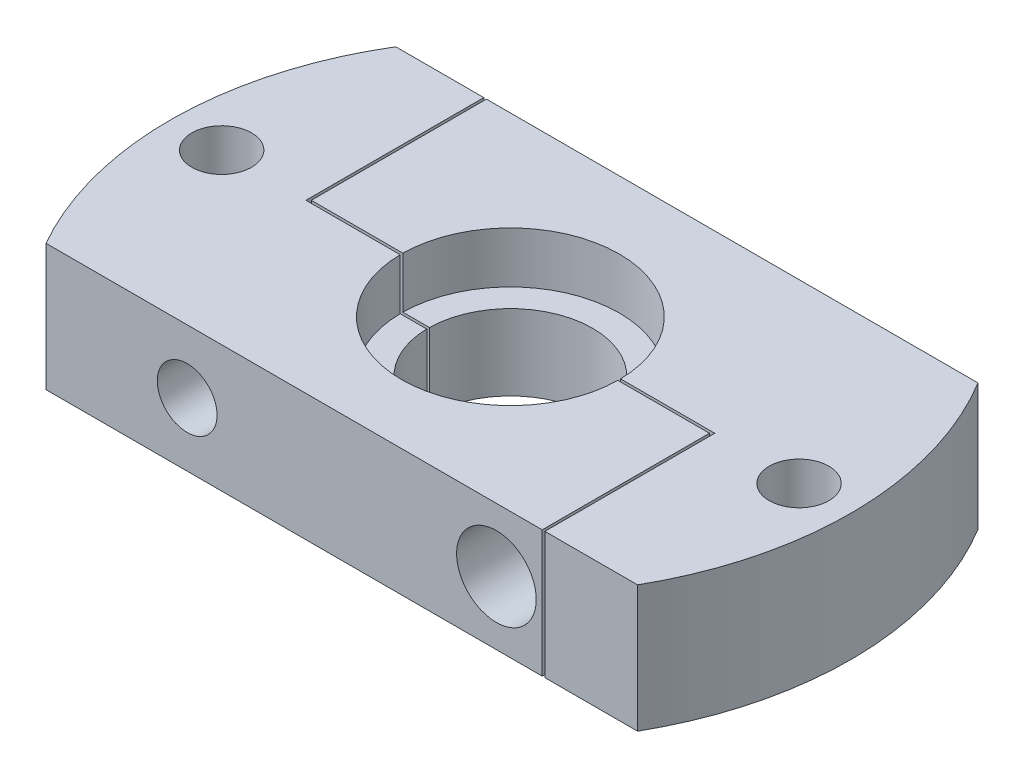
ISO-10303-21;
HEADER;
FILE_DESCRIPTION(('STEP AP214'),'2;1');
FILE_NAME('part.step','',(''),(''),'','','');
FILE_SCHEMA(('AUTOMOTIVE_DESIGN { 1 0 10303 214 1 1 1 1 }'));
ENDSEC;
DATA;
#1=APPLICATION_CONTEXT('core data for automotive mechanical design processes');
#2=APPLICATION_PROTOCOL_DEFINITION('international standard','automotive_design',2000,#1);
#3=PRODUCT_CONTEXT('',#1,'mechanical');
#4=PRODUCT('Part','Part','',(#3));
#5=PRODUCT_RELATED_PRODUCT_CATEGORY('part','',(#4));
#6=PRODUCT_DEFINITION_FORMATION('','',#4);
#7=PRODUCT_DEFINITION_CONTEXT('part definition',#1,'design');
#8=PRODUCT_DEFINITION('design','',#6,#7);
#9=PRODUCT_DEFINITION_SHAPE('','',#8);
#10=(LENGTH_UNIT() NAMED_UNIT(*) SI_UNIT(.MILLI.,.METRE.));
#11=(NAMED_UNIT(*) PLANE_ANGLE_UNIT() SI_UNIT($,.RADIAN.));
#12=(NAMED_UNIT(*) SI_UNIT($,.STERADIAN.) SOLID_ANGLE_UNIT());
#13=UNCERTAINTY_MEASURE_WITH_UNIT(LENGTH_MEASURE(1.E-05),#10,'distance_accuracy_value','');
#14=(GEOMETRIC_REPRESENTATION_CONTEXT(3) GLOBAL_UNCERTAINTY_ASSIGNED_CONTEXT((#13)) GLOBAL_UNIT_ASSIGNED_CONTEXT((#10,
#11,#12)) REPRESENTATION_CONTEXT('',''));
#15=CARTESIAN_POINT('',(0.,0.,0.));
#16=DIRECTION('',(0.,0.,1.));
#17=DIRECTION('',(1.,0.,0.));
#18=AXIS2_PLACEMENT_3D('',#15,#16,#17);
#19=CARTESIAN_POINT('',(6.19999999999999,58.45,0.));
#20=DIRECTION('',(0.,1.,0.));
#21=DIRECTION('',(0.,0.,1.));
#22=AXIS2_PLACEMENT_3D('',#19,#20,#21);
#23=PLANE('',#22);
#24=CARTESIAN_POINT('',(0.,58.45,0.));
#25=DIRECTION('',(0.,-1.,0.));
#26=DIRECTION('',(0.,0.,-1.));
#27=AXIS2_PLACEMENT_3D('',#24,#25,#26);
#28=CIRCLE('',#27,8.19999999999999);
#29=CARTESIAN_POINT('',(-8.19939022122986,58.45,-0.100000000000002));
#30=VERTEX_POINT('',#29);
#31=CARTESIAN_POINT('',(8.19939022122986,58.45,-0.100000000000007));
#32=VERTEX_POINT('',#31);
#33=EDGE_CURVE('E159',#30,#32,#28,.T.);
#34=ORIENTED_EDGE('',*,*,#33,.F.);
#35=DIRECTION('',(1.,0.,0.));
#36=VECTOR('',#35,1.);
#37=CARTESIAN_POINT('',(6.19999999999999,58.45,-0.100000000000007));
#38=LINE('',#37,#36);
#39=CARTESIAN_POINT('',(-6.19919349593154,58.45,-0.100000000000003));
#40=VERTEX_POINT('',#39);
#41=EDGE_CURVE('E187',#30,#40,#38,.T.);
#42=ORIENTED_EDGE('',*,*,#41,.T.);
#43=CARTESIAN_POINT('',(0.,58.45,0.));
#44=DIRECTION('',(0.,-1.,0.));
#45=DIRECTION('',(0.,0.,-1.));
#46=AXIS2_PLACEMENT_3D('',#43,#44,#45);
#47=CIRCLE('',#46,6.19999999999999);
#48=CARTESIAN_POINT('',(6.19919349593154,58.45,-0.100000000000007));
#49=VERTEX_POINT('',#48);
#50=EDGE_CURVE('E186',#40,#49,#47,.T.);
#51=ORIENTED_EDGE('',*,*,#50,.T.);
#52=EDGE_CURVE('E181',#49,#32,#38,.T.);
#53=ORIENTED_EDGE('',*,*,#52,.T.);
#54=EDGE_LOOP('',(#34,#42,#51,#53));
#55=FACE_BOUND('',#54,.T.);
#56=ADVANCED_FACE('F51',(#55),#23,.T.);
#57=CARTESIAN_POINT('',(0.,0.,0.));
#58=DIRECTION('',(0.,-1.,0.));
#59=DIRECTION('',(0.,0.,-1.));
#60=AXIS2_PLACEMENT_3D('',#57,#58,#59);
#61=CYLINDRICAL_SURFACE('',#60,6.19999999999999);
#62=ORIENTED_EDGE('',*,*,#50,.F.);
#63=DIRECTION('',(0.,-1.,0.));
#64=VECTOR('',#63,1.);
#65=CARTESIAN_POINT('',(-6.19919349593154,0.,-0.100000000000003));
#66=LINE('',#65,#64);
#67=CARTESIAN_POINT('',(-6.19919349593154,52.75,-0.100000000000003));
#68=VERTEX_POINT('',#67);
#69=EDGE_CURVE('E92',#40,#68,#66,.T.);
#70=ORIENTED_EDGE('',*,*,#69,.T.);
#71=CARTESIAN_POINT('',(0.,52.75,0.));
#72=DIRECTION('',(0.,-1.,0.));
#73=DIRECTION('',(0.,0.,-1.));
#74=AXIS2_PLACEMENT_3D('',#71,#72,#73);
#75=CIRCLE('',#74,6.19999999999999);
#76=CARTESIAN_POINT('',(6.19919349593154,52.75,-0.100000000000007));
#77=VERTEX_POINT('',#76);
#78=EDGE_CURVE('E180',#68,#77,#75,.T.);
#79=ORIENTED_EDGE('',*,*,#78,.T.);
#80=DIRECTION('',(0.,-1.,0.));
#81=VECTOR('',#80,1.);
#82=CARTESIAN_POINT('',(6.19919349593154,0.,-0.100000000000007));
#83=LINE('',#82,#81);
#84=EDGE_CURVE('E166',#77,#49,#83,.F.);
#85=ORIENTED_EDGE('',*,*,#84,.T.);
#86=EDGE_LOOP('',(#62,#70,#79,#85));
#87=FACE_BOUND('',#86,.T.);
#88=ADVANCED_FACE('F226',(#87),#61,.F.);
#89=CARTESIAN_POINT('',(6.19999999999999,52.75,0.));
#90=DIRECTION('',(0.,-1.,0.));
#91=DIRECTION('',(0.,0.,-1.));
#92=AXIS2_PLACEMENT_3D('',#89,#90,#91);
#93=PLANE('',#92);
#94=DIRECTION('',(0.,0.,1.));
#95=VECTOR('',#94,1.);
#96=CARTESIAN_POINT('',(15.3,52.75,0.));
#97=LINE('',#96,#95);
#98=CARTESIAN_POINT('',(15.3,52.75,-0.100000000000009));
#99=VERTEX_POINT('',#98);
#100=CARTESIAN_POINT('',(15.3,52.75,12.7));
#101=VERTEX_POINT('',#100);
#102=EDGE_CURVE('E127',#99,#101,#97,.T.);
#103=ORIENTED_EDGE('',*,*,#102,.F.);
#104=DIRECTION('',(1.,0.,0.));
#105=VECTOR('',#104,1.);
#106=CARTESIAN_POINT('',(0.,52.75,-0.100000000000005));
#107=LINE('',#106,#105);
#108=EDGE_CURVE('E156',#77,#99,#107,.T.);
#109=ORIENTED_EDGE('',*,*,#108,.F.);
#110=ORIENTED_EDGE('',*,*,#78,.F.);
#111=CARTESIAN_POINT('',(-15.1,52.75,-0.1));
#112=VERTEX_POINT('',#111);
#113=EDGE_CURVE('E147',#112,#68,#107,.T.);
#114=ORIENTED_EDGE('',*,*,#113,.F.);
#115=DIRECTION('',(0.,0.,1.));
#116=VECTOR('',#115,1.);
#117=CARTESIAN_POINT('',(-15.1,52.75,0.));
#118=LINE('',#117,#116);
#119=CARTESIAN_POINT('',(-15.1,52.75,-13.3));
#120=VERTEX_POINT('',#119);
#121=EDGE_CURVE('E202',#120,#112,#118,.T.);
#122=ORIENTED_EDGE('',*,*,#121,.F.);
#123=DIRECTION('',(1.,0.,0.));
#124=VECTOR('',#123,1.);
#125=CARTESIAN_POINT('',(0.,52.75,-13.3));
#126=LINE('',#125,#124);
#127=CARTESIAN_POINT('',(21.9324531231689,52.75,-13.3));
#128=VERTEX_POINT('',#127);
#129=EDGE_CURVE('E164',#120,#128,#126,.T.);
#130=ORIENTED_EDGE('',*,*,#129,.T.);
#131=CARTESIAN_POINT('',(0.,52.75,0.));
#132=DIRECTION('',(0.,-1.,0.));
#133=DIRECTION('',(0.,0.,-1.));
#134=AXIS2_PLACEMENT_3D('',#131,#132,#133);
#135=CIRCLE('',#134,25.65);
#136=CARTESIAN_POINT('',(22.2852529714159,52.75,12.7));
#137=VERTEX_POINT('',#136);
#138=EDGE_CURVE('E152',#128,#137,#135,.T.);
#139=ORIENTED_EDGE('',*,*,#138,.T.);
#140=DIRECTION('',(1.,0.,0.));
#141=VECTOR('',#140,1.);
#142=CARTESIAN_POINT('',(0.,52.75,12.7));
#143=LINE('',#142,#141);
#144=EDGE_CURVE('E143',#101,#137,#143,.T.);
#145=ORIENTED_EDGE('',*,*,#144,.F.);
#146=EDGE_LOOP('',(#103,#109,#110,#114,#122,#130,#139,#145));
#147=FACE_BOUND('',#146,.T.);
#148=ADVANCED_FACE('F150',(#147),#93,.T.);
#149=CARTESIAN_POINT('',(0.,0.,0.));
#150=DIRECTION('',(0.,-1.,0.));
#151=DIRECTION('',(0.,0.,-1.));
#152=AXIS2_PLACEMENT_3D('',#149,#150,#151);
#153=CYLINDRICAL_SURFACE('',#152,25.65);
#154=CARTESIAN_POINT('',(0.,62.3,0.));
#155=DIRECTION('',(0.,-1.,0.));
#156=DIRECTION('',(0.,0.,-1.));
#157=AXIS2_PLACEMENT_3D('',#154,#155,#156);
#158=CIRCLE('',#157,25.65);
#159=CARTESIAN_POINT('',(21.9324531231689,62.300006,-13.3));
#160=VERTEX_POINT('',#159);
#161=CARTESIAN_POINT('',(22.2852529714159,62.300006,12.7));
#162=VERTEX_POINT('',#161);
#163=EDGE_CURVE('E170',#160,#162,#158,.T.);
#164=ORIENTED_EDGE('',*,*,#163,.T.);
#165=DIRECTION('',(0.,1.,0.));
#166=VECTOR('',#165,1.);
#167=CARTESIAN_POINT('',(22.2852529714159,52.75,12.7));
#168=LINE('',#167,#166);
#169=EDGE_CURVE('E153',#137,#162,#168,.T.);
#170=ORIENTED_EDGE('',*,*,#169,.F.);
#171=ORIENTED_EDGE('',*,*,#138,.F.);
#172=DIRECTION('',(0.,1.,0.));
#173=VECTOR('',#172,1.);
#174=CARTESIAN_POINT('',(21.9324531231689,52.75,-13.3));
#175=LINE('',#174,#173);
#176=EDGE_CURVE('E70',#128,#160,#175,.T.);
#177=ORIENTED_EDGE('',*,*,#176,.T.);
#178=EDGE_LOOP('',(#164,#170,#171,#177));
#179=FACE_BOUND('',#178,.T.);
#180=ADVANCED_FACE('F278',(#179),#153,.T.);
#181=CARTESIAN_POINT('',(25.65,62.3,0.));
#182=DIRECTION('',(0.,1.,0.));
#183=DIRECTION('',(0.,0.,1.));
#184=AXIS2_PLACEMENT_3D('',#181,#182,#183);
#185=PLANE('',#184);
#186=CARTESIAN_POINT('',(21.75,62.3,0.));
#187=DIRECTION('',(0.,1.,0.));
#188=DIRECTION('',(0.,0.,1.));
#189=AXIS2_PLACEMENT_3D('',#186,#187,#188);
#190=CIRCLE('',#189,2.25);
#191=CARTESIAN_POINT('',(21.75,62.3,2.24999999999999));
#192=VERTEX_POINT('',#191);
#193=EDGE_CURVE('E262',#192,#192,#190,.T.);
#194=ORIENTED_EDGE('',*,*,#193,.F.);
#195=EDGE_LOOP('',(#194));
#196=FACE_BOUND('',#195,.T.);
#197=CARTESIAN_POINT('',(0.,62.3,0.));
#198=DIRECTION('',(0.,-1.,0.));
#199=DIRECTION('',(0.,0.,-1.));
#200=AXIS2_PLACEMENT_3D('',#197,#198,#199);
#201=CIRCLE('',#200,8.19999999999999);
#202=CARTESIAN_POINT('',(-8.19939022122986,62.3,-0.100000000000002));
#203=VERTEX_POINT('',#202);
#204=CARTESIAN_POINT('',(8.19939022122986,62.3,-0.100000000000007));
#205=VERTEX_POINT('',#204);
#206=EDGE_CURVE('E192',#203,#205,#201,.T.);
#207=ORIENTED_EDGE('',*,*,#206,.T.);
#208=DIRECTION('',(1.,0.,0.));
#209=VECTOR('',#208,1.);
#210=CARTESIAN_POINT('',(25.65,62.3,-0.100000000000012));
#211=LINE('',#210,#209);
#212=CARTESIAN_POINT('',(15.3,62.3,-0.100000000000009));
#213=VERTEX_POINT('',#212);
#214=EDGE_CURVE('E188',#205,#213,#211,.T.);
#215=ORIENTED_EDGE('',*,*,#214,.T.);
#216=DIRECTION('',(0.,0.,1.));
#217=VECTOR('',#216,1.);
#218=CARTESIAN_POINT('',(15.3,62.3,0.));
#219=LINE('',#218,#217);
#220=CARTESIAN_POINT('',(15.3,62.3,12.7));
#221=VERTEX_POINT('',#220);
#222=EDGE_CURVE('E191',#213,#221,#219,.T.);
#223=ORIENTED_EDGE('',*,*,#222,.T.);
#224=DIRECTION('',(1.,0.,0.));
#225=VECTOR('',#224,1.);
#226=CARTESIAN_POINT('',(25.65,62.3,12.7));
#227=LINE('',#226,#225);
#228=EDGE_CURVE('E146',#221,#162,#227,.T.);
#229=ORIENTED_EDGE('',*,*,#228,.T.);
#230=ORIENTED_EDGE('',*,*,#163,.F.);
#231=DIRECTION('',(1.,0.,0.));
#232=VECTOR('',#231,1.);
#233=CARTESIAN_POINT('',(25.65,62.3,-13.3));
#234=LINE('',#233,#232);
#235=CARTESIAN_POINT('',(-15.1,62.3,-13.3));
#236=VERTEX_POINT('',#235);
#237=EDGE_CURVE('E61',#236,#160,#234,.T.);
#238=ORIENTED_EDGE('',*,*,#237,.F.);
#239=DIRECTION('',(0.,0.,1.));
#240=VECTOR('',#239,1.);
#241=CARTESIAN_POINT('',(-15.1,62.3,0.));
#242=LINE('',#241,#240);
#243=CARTESIAN_POINT('',(-15.1,62.3,-0.1));
#244=VERTEX_POINT('',#243);
#245=EDGE_CURVE('E233',#236,#244,#242,.T.);
#246=ORIENTED_EDGE('',*,*,#245,.T.);
#247=EDGE_CURVE('E177',#244,#203,#211,.T.);
#248=ORIENTED_EDGE('',*,*,#247,.T.);
#249=EDGE_LOOP('',(#207,#215,#223,#229,#230,#238,#246,#248));
#250=FACE_BOUND('',#249,.T.);
#251=ADVANCED_FACE('F213',(#196,#250),#185,.T.);
#252=CARTESIAN_POINT('',(0.,0.,0.));
#253=DIRECTION('',(0.,-1.,0.));
#254=DIRECTION('',(0.,0.,-1.));
#255=AXIS2_PLACEMENT_3D('',#252,#253,#254);
#256=CYLINDRICAL_SURFACE('',#255,8.19999999999999);
#257=ORIENTED_EDGE('',*,*,#206,.F.);
#258=DIRECTION('',(0.,-1.,0.));
#259=VECTOR('',#258,1.);
#260=CARTESIAN_POINT('',(-8.19939022122986,0.,-0.100000000000002));
#261=LINE('',#260,#259);
#262=EDGE_CURVE('E175',#203,#30,#261,.T.);
#263=ORIENTED_EDGE('',*,*,#262,.T.);
#264=ORIENTED_EDGE('',*,*,#33,.T.);
#265=DIRECTION('',(0.,-1.,0.));
#266=VECTOR('',#265,1.);
#267=CARTESIAN_POINT('',(8.19939022122986,0.,-0.100000000000007));
#268=LINE('',#267,#266);
#269=EDGE_CURVE('E154',#32,#205,#268,.F.);
#270=ORIENTED_EDGE('',*,*,#269,.T.);
#271=EDGE_LOOP('',(#257,#263,#264,#270));
#272=FACE_BOUND('',#271,.T.);
#273=ADVANCED_FACE('F218',(#272),#256,.F.);
#274=CARTESIAN_POINT('',(0.,52.75,12.7));
#275=DIRECTION('',(0.,0.,1.));
#276=DIRECTION('',(1.,0.,0.));
#277=AXIS2_PLACEMENT_3D('',#274,#275,#276);
#278=PLANE('',#277);
#279=DIRECTION('',(0.,1.,0.));
#280=VECTOR('',#279,1.);
#281=CARTESIAN_POINT('',(15.3,52.75,12.7));
#282=LINE('',#281,#280);
#283=EDGE_CURVE('E130',#101,#221,#282,.T.);
#284=ORIENTED_EDGE('',*,*,#283,.F.);
#285=ORIENTED_EDGE('',*,*,#144,.T.);
#286=ORIENTED_EDGE('',*,*,#169,.T.);
#287=ORIENTED_EDGE('',*,*,#228,.F.);
#288=EDGE_LOOP('',(#284,#285,#286,#287));
#289=FACE_BOUND('',#288,.T.);
#290=ADVANCED_FACE('F141',(#289),#278,.T.);
#291=CARTESIAN_POINT('',(0.,52.75,-0.100000000000005));
#292=DIRECTION('',(0.,0.,1.));
#293=DIRECTION('',(1.,0.,0.));
#294=AXIS2_PLACEMENT_3D('',#291,#292,#293);
#295=PLANE('',#294);
#296=CARTESIAN_POINT('',(11.6496951106149,57.525,-0.100000000000008));
#297=DIRECTION('',(0.,0.,1.));
#298=DIRECTION('',(1.,0.,0.));
#299=AXIS2_PLACEMENT_3D('',#296,#297,#298);
#300=CIRCLE('',#299,1.7);
#301=CARTESIAN_POINT('',(13.3496951106149,57.525,-0.100000000000009));
#302=VERTEX_POINT('',#301);
#303=EDGE_CURVE('E252',#302,#302,#300,.T.);
#304=ORIENTED_EDGE('',*,*,#303,.F.);
#305=EDGE_LOOP('',(#304));
#306=FACE_BOUND('',#305,.T.);
#307=ORIENTED_EDGE('',*,*,#108,.T.);
#308=DIRECTION('',(0.,1.,0.));
#309=VECTOR('',#308,1.);
#310=CARTESIAN_POINT('',(15.3,52.75,-0.100000000000009));
#311=LINE('',#310,#309);
#312=EDGE_CURVE('E133',#99,#213,#311,.T.);
#313=ORIENTED_EDGE('',*,*,#312,.T.);
#314=ORIENTED_EDGE('',*,*,#214,.F.);
#315=ORIENTED_EDGE('',*,*,#269,.F.);
#316=ORIENTED_EDGE('',*,*,#52,.F.);
#317=ORIENTED_EDGE('',*,*,#84,.F.);
#318=EDGE_LOOP('',(#307,#313,#314,#315,#316,#317));
#319=FACE_BOUND('',#318,.T.);
#320=ADVANCED_FACE('F222',(#306,#319),#295,.T.);
#321=CARTESIAN_POINT('',(15.3,52.75,0.));
#322=DIRECTION('',(-1.,0.,0.));
#323=DIRECTION('',(0.,0.,1.));
#324=AXIS2_PLACEMENT_3D('',#321,#322,#323);
#325=PLANE('',#324);
#326=ORIENTED_EDGE('',*,*,#312,.F.);
#327=ORIENTED_EDGE('',*,*,#102,.T.);
#328=ORIENTED_EDGE('',*,*,#283,.T.);
#329=ORIENTED_EDGE('',*,*,#222,.F.);
#330=EDGE_LOOP('',(#326,#327,#328,#329));
#331=FACE_BOUND('',#330,.T.);
#332=ADVANCED_FACE('F129',(#331),#325,.T.);
#333=CARTESIAN_POINT('',(-11.6496951106149,57.525,-0.100000000000001));
#334=DIRECTION('',(0.,0.,1.));
#335=DIRECTION('',(1.,0.,0.));
#336=AXIS2_PLACEMENT_3D('',#333,#334,#335);
#337=CIRCLE('',#336,1.7);
#338=CARTESIAN_POINT('',(-9.94969511061493,57.525,-0.100000000000002));
#339=VERTEX_POINT('',#338);
#340=EDGE_CURVE('E168',#339,#339,#337,.T.);
#341=ORIENTED_EDGE('',*,*,#340,.F.);
#342=EDGE_LOOP('',(#341));
#343=FACE_BOUND('',#342,.T.);
#344=ORIENTED_EDGE('',*,*,#41,.F.);
#345=ORIENTED_EDGE('',*,*,#262,.F.);
#346=ORIENTED_EDGE('',*,*,#247,.F.);
#347=DIRECTION('',(0.,1.,0.));
#348=VECTOR('',#347,1.);
#349=CARTESIAN_POINT('',(-15.1,52.75,-0.1));
#350=LINE('',#349,#348);
#351=EDGE_CURVE('E199',#112,#244,#350,.T.);
#352=ORIENTED_EDGE('',*,*,#351,.F.);
#353=ORIENTED_EDGE('',*,*,#113,.T.);
#354=ORIENTED_EDGE('',*,*,#69,.F.);
#355=EDGE_LOOP('',(#344,#345,#346,#352,#353,#354));
#356=FACE_BOUND('',#355,.T.);
#357=ADVANCED_FACE('F231',(#343,#356),#295,.T.);
#358=CARTESIAN_POINT('',(-15.1,52.75,0.));
#359=DIRECTION('',(-1.,0.,0.));
#360=DIRECTION('',(0.,0.,1.));
#361=AXIS2_PLACEMENT_3D('',#358,#359,#360);
#362=PLANE('',#361);
#363=DIRECTION('',(0.,1.,0.));
#364=VECTOR('',#363,1.);
#365=CARTESIAN_POINT('',(-15.1,52.75,-13.3));
#366=LINE('',#365,#364);
#367=EDGE_CURVE('E12',#120,#236,#366,.T.);
#368=ORIENTED_EDGE('',*,*,#367,.F.);
#369=ORIENTED_EDGE('',*,*,#121,.T.);
#370=ORIENTED_EDGE('',*,*,#351,.T.);
#371=ORIENTED_EDGE('',*,*,#245,.F.);
#372=EDGE_LOOP('',(#368,#369,#370,#371));
#373=FACE_BOUND('',#372,.T.);
#374=ADVANCED_FACE('F232',(#373),#362,.T.);
#375=CARTESIAN_POINT('',(0.,52.75,-13.3));
#376=DIRECTION('',(0.,0.,1.));
#377=DIRECTION('',(1.,0.,0.));
#378=AXIS2_PLACEMENT_3D('',#375,#376,#377);
#379=PLANE('',#378);
#380=CARTESIAN_POINT('',(11.6496951106149,57.525,-13.3));
#381=DIRECTION('',(0.,0.,1.));
#382=DIRECTION('',(1.,0.,0.));
#383=AXIS2_PLACEMENT_3D('',#380,#381,#382);
#384=CIRCLE('',#383,2.25);
#385=CARTESIAN_POINT('',(13.8996951106149,57.525,-13.3));
#386=VERTEX_POINT('',#385);
#387=EDGE_CURVE('E255',#386,#386,#384,.T.);
#388=ORIENTED_EDGE('',*,*,#387,.T.);
#389=EDGE_LOOP('',(#388));
#390=FACE_BOUND('',#389,.T.);
#391=CARTESIAN_POINT('',(-11.6496951106149,57.525,-13.3));
#392=DIRECTION('',(0.,0.,-1.));
#393=DIRECTION('',(-1.,0.,0.));
#394=AXIS2_PLACEMENT_3D('',#391,#392,#393);
#395=CIRCLE('',#394,3.);
#396=CARTESIAN_POINT('',(-14.6496951106149,57.525,-13.3));
#397=VERTEX_POINT('',#396);
#398=EDGE_CURVE('E249',#397,#397,#395,.T.);
#399=ORIENTED_EDGE('',*,*,#398,.F.);
#400=EDGE_LOOP('',(#399));
#401=FACE_BOUND('',#400,.T.);
#402=ORIENTED_EDGE('',*,*,#237,.T.);
#403=ORIENTED_EDGE('',*,*,#176,.F.);
#404=ORIENTED_EDGE('',*,*,#129,.F.);
#405=ORIENTED_EDGE('',*,*,#367,.T.);
#406=EDGE_LOOP('',(#402,#403,#404,#405));
#407=FACE_BOUND('',#406,.T.);
#408=ADVANCED_FACE('F53',(#390,#401,#407),#379,.F.);
#409=CARTESIAN_POINT('',(-11.6496951106149,57.525,-13.3));
#410=DIRECTION('',(0.,0.,-1.));
#411=DIRECTION('',(-1.,0.,0.));
#412=AXIS2_PLACEMENT_3D('',#409,#410,#411);
#413=CYLINDRICAL_SURFACE('',#412,1.7);
#414=ORIENTED_EDGE('',*,*,#340,.T.);
#415=EDGE_LOOP('',(#414));
#416=FACE_BOUND('',#415,.T.);
#417=CARTESIAN_POINT('',(-11.6496951106149,57.525,-3.9));
#418=DIRECTION('',(0.,0.,-1.));
#419=DIRECTION('',(-1.,0.,0.));
#420=AXIS2_PLACEMENT_3D('',#417,#418,#419);
#421=CIRCLE('',#420,1.7);
#422=CARTESIAN_POINT('',(-13.3496951106149,57.525,-3.9));
#423=VERTEX_POINT('',#422);
#424=EDGE_CURVE('E243',#423,#423,#421,.T.);
#425=ORIENTED_EDGE('',*,*,#424,.T.);
#426=EDGE_LOOP('',(#425));
#427=FACE_BOUND('',#426,.T.);
#428=ADVANCED_FACE('F318',(#416,#427),#413,.F.);
#429=CARTESIAN_POINT('',(-9.94969511061493,57.525,-3.9));
#430=DIRECTION('',(0.,0.,1.));
#431=DIRECTION('',(1.,0.,0.));
#432=AXIS2_PLACEMENT_3D('',#429,#430,#431);
#433=PLANE('',#432);
#434=ORIENTED_EDGE('',*,*,#424,.F.);
#435=EDGE_LOOP('',(#434));
#436=FACE_BOUND('',#435,.T.);
#437=CARTESIAN_POINT('',(-11.6496951106149,57.525,-3.9));
#438=DIRECTION('',(0.,0.,-1.));
#439=DIRECTION('',(-1.,0.,0.));
#440=AXIS2_PLACEMENT_3D('',#437,#438,#439);
#441=CIRCLE('',#440,3.);
#442=CARTESIAN_POINT('',(-14.6496951106149,57.525,-3.9));
#443=VERTEX_POINT('',#442);
#444=EDGE_CURVE('E246',#443,#443,#441,.T.);
#445=ORIENTED_EDGE('',*,*,#444,.T.);
#446=EDGE_LOOP('',(#445));
#447=FACE_BOUND('',#446,.T.);
#448=ADVANCED_FACE('F320',(#436,#447),#433,.F.);
#449=CARTESIAN_POINT('',(-11.6496951106149,57.525,-13.3));
#450=DIRECTION('',(0.,0.,-1.));
#451=DIRECTION('',(-1.,0.,0.));
#452=AXIS2_PLACEMENT_3D('',#449,#450,#451);
#453=CYLINDRICAL_SURFACE('',#452,3.);
#454=ORIENTED_EDGE('',*,*,#444,.F.);
#455=EDGE_LOOP('',(#454));
#456=FACE_BOUND('',#455,.T.);
#457=ORIENTED_EDGE('',*,*,#398,.T.);
#458=EDGE_LOOP('',(#457));
#459=FACE_BOUND('',#458,.T.);
#460=ADVANCED_FACE('F326',(#456,#459),#453,.F.);
#461=CARTESIAN_POINT('',(11.6496951106149,57.525,12.7));
#462=DIRECTION('',(0.,0.,1.));
#463=DIRECTION('',(1.,0.,0.));
#464=AXIS2_PLACEMENT_3D('',#461,#462,#463);
#465=CYLINDRICAL_SURFACE('',#464,1.7);
#466=CARTESIAN_POINT('',(11.6496951106149,57.525,-9.05));
#467=DIRECTION('',(0.,0.,1.));
#468=DIRECTION('',(1.,0.,0.));
#469=AXIS2_PLACEMENT_3D('',#466,#467,#468);
#470=CIRCLE('',#469,1.7);
#471=CARTESIAN_POINT('',(13.3496951106149,57.525,-9.05));
#472=VERTEX_POINT('',#471);
#473=EDGE_CURVE('E55',#472,#472,#470,.F.);
#474=ORIENTED_EDGE('',*,*,#473,.T.);
#475=EDGE_LOOP('',(#474));
#476=FACE_BOUND('',#475,.T.);
#477=ORIENTED_EDGE('',*,*,#303,.T.);
#478=EDGE_LOOP('',(#477));
#479=FACE_BOUND('',#478,.T.);
#480=ADVANCED_FACE('F331',(#476,#479),#465,.F.);
#481=CARTESIAN_POINT('',(11.6496951106149,57.525,-9.05));
#482=DIRECTION('',(0.,0.,1.));
#483=DIRECTION('',(1.,0.,0.));
#484=AXIS2_PLACEMENT_3D('',#481,#482,#483);
#485=PLANE('',#484);
#486=CARTESIAN_POINT('',(11.6496951106149,57.525,-9.05));
#487=DIRECTION('',(0.,0.,1.));
#488=DIRECTION('',(1.,0.,0.));
#489=AXIS2_PLACEMENT_3D('',#486,#487,#488);
#490=CIRCLE('',#489,2.25);
#491=CARTESIAN_POINT('',(13.8996951106149,57.525,-9.05));
#492=VERTEX_POINT('',#491);
#493=EDGE_CURVE('E258',#492,#492,#490,.T.);
#494=ORIENTED_EDGE('',*,*,#493,.F.);
#495=EDGE_LOOP('',(#494));
#496=FACE_BOUND('',#495,.T.);
#497=ORIENTED_EDGE('',*,*,#473,.F.);
#498=EDGE_LOOP('',(#497));
#499=FACE_BOUND('',#498,.T.);
#500=ADVANCED_FACE('F342',(#496,#499),#485,.F.);
#501=CARTESIAN_POINT('',(11.6496951106149,57.525,-9.05));
#502=DIRECTION('',(0.,0.,-1.));
#503=DIRECTION('',(-1.,0.,0.));
#504=AXIS2_PLACEMENT_3D('',#501,#502,#503);
#505=CYLINDRICAL_SURFACE('',#504,2.25);
#506=ORIENTED_EDGE('',*,*,#493,.T.);
#507=EDGE_LOOP('',(#506));
#508=FACE_BOUND('',#507,.T.);
#509=ORIENTED_EDGE('',*,*,#387,.F.);
#510=EDGE_LOOP('',(#509));
#511=FACE_BOUND('',#510,.T.);
#512=ADVANCED_FACE('F273',(#508,#511),#505,.F.);
#513=CARTESIAN_POINT('',(21.75,57.3,0.));
#514=DIRECTION('',(0.,1.,0.));
#515=DIRECTION('',(0.,0.,1.));
#516=AXIS2_PLACEMENT_3D('',#513,#514,#515);
#517=CYLINDRICAL_SURFACE('',#516,2.25);
#518=CARTESIAN_POINT('',(21.75,57.3,0.));
#519=DIRECTION('',(0.,1.,0.));
#520=DIRECTION('',(0.,0.,1.));
#521=AXIS2_PLACEMENT_3D('',#518,#519,#520);
#522=CIRCLE('',#521,2.25);
#523=CARTESIAN_POINT('',(21.75,57.3,2.24999999999999));
#524=VERTEX_POINT('',#523);
#525=EDGE_CURVE('E259',#524,#524,#522,.T.);
#526=ORIENTED_EDGE('',*,*,#525,.F.);
#527=EDGE_LOOP('',(#526));
#528=FACE_BOUND('',#527,.T.);
#529=ORIENTED_EDGE('',*,*,#193,.T.);
#530=EDGE_LOOP('',(#529));
#531=FACE_BOUND('',#530,.T.);
#532=ADVANCED_FACE('F270',(#528,#531),#517,.F.);
#533=CARTESIAN_POINT('',(21.75,57.3,0.));
#534=DIRECTION('',(0.,1.,0.));
#535=DIRECTION('',(0.,0.,1.));
#536=AXIS2_PLACEMENT_3D('',#533,#534,#535);
#537=PLANE('',#536);
#538=ORIENTED_EDGE('',*,*,#525,.T.);
#539=EDGE_LOOP('',(#538));
#540=FACE_BOUND('',#539,.T.);
#541=ADVANCED_FACE('F268',(#540),#537,.T.);
#542=CLOSED_SHELL('',(#56,#88,#148,#180,#251,#273,#290,#320,#332,#357,#374,#408,#428,#448,#460,
#480,#500,#512,#532,#541));
#543=MANIFOLD_SOLID_BREP('B2',#542);
#544=CARTESIAN_POINT('',(-11.6496951106149,57.525,-13.3));
#545=DIRECTION('',(0.,0.,-1.));
#546=DIRECTION('',(-1.,0.,0.));
#547=AXIS2_PLACEMENT_3D('',#544,#545,#546);
#548=CYLINDRICAL_SURFACE('',#547,1.7);
#549=CARTESIAN_POINT('',(-11.6496951106149,57.525,0.0999999999999994));
#550=DIRECTION('',(0.,0.,1.));
#551=DIRECTION('',(1.,0.,0.));
#552=AXIS2_PLACEMENT_3D('',#549,#550,#551);
#553=CIRCLE('',#552,1.7);
#554=CARTESIAN_POINT('',(-9.94969511061493,57.525,0.0999999999999989));
#555=VERTEX_POINT('',#554);
#556=EDGE_CURVE('E591',#555,#555,#553,.T.);
#557=ORIENTED_EDGE('',*,*,#556,.F.);
#558=EDGE_LOOP('',(#557));
#559=FACE_BOUND('',#558,.T.);
#560=CARTESIAN_POINT('',(-11.6496951106149,57.525,8.45));
#561=DIRECTION('',(0.,0.,1.));
#562=DIRECTION('',(1.,0.,0.));
#563=AXIS2_PLACEMENT_3D('',#560,#561,#562);
#564=CIRCLE('',#563,1.7);
#565=CARTESIAN_POINT('',(-9.94969511061493,57.525,8.45));
#566=VERTEX_POINT('',#565);
#567=EDGE_CURVE('E473',#566,#566,#564,.F.);
#568=ORIENTED_EDGE('',*,*,#567,.F.);
#569=EDGE_LOOP('',(#568));
#570=FACE_BOUND('',#569,.T.);
#571=ADVANCED_FACE('F469',(#559,#570),#548,.F.);
#572=CARTESIAN_POINT('',(0.,0.,0.));
#573=DIRECTION('',(0.,-1.,0.));
#574=DIRECTION('',(0.,0.,-1.));
#575=AXIS2_PLACEMENT_3D('',#572,#573,#574);
#576=CYLINDRICAL_SURFACE('',#575,8.19999999999999);
#577=DIRECTION('',(0.,-1.,0.));
#578=VECTOR('',#577,1.);
#579=CARTESIAN_POINT('',(-8.19939022122986,0.,0.0999999999999979));
#580=LINE('',#579,#578);
#581=CARTESIAN_POINT('',(-8.19939022122986,62.3,0.0999999999999979));
#582=VERTEX_POINT('',#581);
#583=CARTESIAN_POINT('',(-8.19939022122986,58.45,0.0999999999999979));
#584=VERTEX_POINT('',#583);
#585=EDGE_CURVE('E584',#582,#584,#580,.T.);
#586=ORIENTED_EDGE('',*,*,#585,.F.);
#587=CARTESIAN_POINT('',(0.,62.3,0.));
#588=DIRECTION('',(0.,-1.,0.));
#589=DIRECTION('',(0.,0.,-1.));
#590=AXIS2_PLACEMENT_3D('',#587,#588,#589);
#591=CIRCLE('',#590,8.19999999999999);
#592=CARTESIAN_POINT('',(8.19939022122986,62.3,0.0999999999999928));
#593=VERTEX_POINT('',#592);
#594=EDGE_CURVE('E571',#593,#582,#591,.T.);
#595=ORIENTED_EDGE('',*,*,#594,.F.);
#596=DIRECTION('',(0.,-1.,0.));
#597=VECTOR('',#596,1.);
#598=CARTESIAN_POINT('',(8.19939022122986,0.,0.0999999999999928));
#599=LINE('',#598,#597);
#600=CARTESIAN_POINT('',(8.19939022122986,58.45,0.0999999999999928));
#601=VERTEX_POINT('',#600);
#602=EDGE_CURVE('E652',#601,#593,#599,.F.);
#603=ORIENTED_EDGE('',*,*,#602,.F.);
#604=CARTESIAN_POINT('',(0.,58.45,0.));
#605=DIRECTION('',(0.,-1.,0.));
#606=DIRECTION('',(0.,0.,-1.));
#607=AXIS2_PLACEMENT_3D('',#604,#605,#606);
#608=CIRCLE('',#607,8.19999999999999);
#609=EDGE_CURVE('E576',#601,#584,#608,.T.);
#610=ORIENTED_EDGE('',*,*,#609,.T.);
#611=EDGE_LOOP('',(#586,#595,#603,#610));
#612=FACE_BOUND('',#611,.T.);
#613=ADVANCED_FACE('F661',(#612),#576,.F.);
#614=CARTESIAN_POINT('',(25.65,62.3,0.));
#615=DIRECTION('',(0.,1.,0.));
#616=DIRECTION('',(0.,0.,1.));
#617=AXIS2_PLACEMENT_3D('',#614,#615,#616);
#618=PLANE('',#617);
#619=CARTESIAN_POINT('',(-21.75,62.3,0.));
#620=DIRECTION('',(0.,1.,0.));
#621=DIRECTION('',(0.,0.,-1.));
#622=AXIS2_PLACEMENT_3D('',#619,#620,#621);
#623=CIRCLE('',#622,2.25);
#624=CARTESIAN_POINT('',(-21.75,62.3,-2.25000000000001));
#625=VERTEX_POINT('',#624);
#626=EDGE_CURVE('E730',#625,#625,#623,.T.);
#627=ORIENTED_EDGE('',*,*,#626,.F.);
#628=EDGE_LOOP('',(#627));
#629=FACE_BOUND('',#628,.T.);
#630=CARTESIAN_POINT('',(0.,62.3,0.));
#631=DIRECTION('',(0.,-1.,0.));
#632=DIRECTION('',(0.,0.,-1.));
#633=AXIS2_PLACEMENT_3D('',#630,#631,#632);
#634=CIRCLE('',#633,25.65);
#635=CARTESIAN_POINT('',(-22.2852529714159,62.300006,12.7));
#636=VERTEX_POINT('',#635);
#637=CARTESIAN_POINT('',(-21.9324531231689,62.300006,-13.3));
#638=VERTEX_POINT('',#637);
#639=EDGE_CURVE('E562',#636,#638,#634,.T.);
#640=ORIENTED_EDGE('',*,*,#639,.F.);
#641=DIRECTION('',(1.,0.,0.));
#642=VECTOR('',#641,1.);
#643=CARTESIAN_POINT('',(25.65,62.3,12.7));
#644=LINE('',#643,#642);
#645=CARTESIAN_POINT('',(15.1,62.3,12.7));
#646=VERTEX_POINT('',#645);
#647=EDGE_CURVE('E49',#636,#646,#644,.T.);
#648=ORIENTED_EDGE('',*,*,#647,.T.);
#649=DIRECTION('',(0.,0.,1.));
#650=VECTOR('',#649,1.);
#651=CARTESIAN_POINT('',(15.1,62.3,0.));
#652=LINE('',#651,#650);
#653=CARTESIAN_POINT('',(15.1,62.3,0.0999999999999907));
#654=VERTEX_POINT('',#653);
#655=EDGE_CURVE('E478',#654,#646,#652,.T.);
#656=ORIENTED_EDGE('',*,*,#655,.F.);
#657=DIRECTION('',(1.,0.,0.));
#658=VECTOR('',#657,1.);
#659=CARTESIAN_POINT('',(25.65,62.3,0.0999999999999875));
#660=LINE('',#659,#658);
#661=EDGE_CURVE('E565',#593,#654,#660,.T.);
#662=ORIENTED_EDGE('',*,*,#661,.F.);
#663=ORIENTED_EDGE('',*,*,#594,.T.);
#664=CARTESIAN_POINT('',(-15.3,62.3,0.1));
#665=VERTEX_POINT('',#664);
#666=EDGE_CURVE('E486',#665,#582,#660,.T.);
#667=ORIENTED_EDGE('',*,*,#666,.F.);
#668=DIRECTION('',(0.,0.,1.));
#669=VECTOR('',#668,1.);
#670=CARTESIAN_POINT('',(-15.3,62.3,0.));
#671=LINE('',#670,#669);
#672=CARTESIAN_POINT('',(-15.3,62.3,-13.3));
#673=VERTEX_POINT('',#672);
#674=EDGE_CURVE('E583',#673,#665,#671,.T.);
#675=ORIENTED_EDGE('',*,*,#674,.F.);
#676=DIRECTION('',(1.,0.,0.));
#677=VECTOR('',#676,1.);
#678=CARTESIAN_POINT('',(25.65,62.3,-13.3));
#679=LINE('',#678,#677);
#680=EDGE_CURVE('E570',#638,#673,#679,.T.);
#681=ORIENTED_EDGE('',*,*,#680,.F.);
#682=EDGE_LOOP('',(#640,#648,#656,#662,#663,#667,#675,#681));
#683=FACE_BOUND('',#682,.T.);
#684=ADVANCED_FACE('F568',(#629,#683),#618,.T.);
#685=CARTESIAN_POINT('',(0.,0.,0.));
#686=DIRECTION('',(0.,-1.,0.));
#687=DIRECTION('',(0.,0.,-1.));
#688=AXIS2_PLACEMENT_3D('',#685,#686,#687);
#689=CYLINDRICAL_SURFACE('',#688,25.65);
#690=CARTESIAN_POINT('',(0.,52.75,0.));
#691=DIRECTION('',(0.,-1.,0.));
#692=DIRECTION('',(0.,0.,-1.));
#693=AXIS2_PLACEMENT_3D('',#690,#691,#692);
#694=CIRCLE('',#693,25.65);
#695=CARTESIAN_POINT('',(-22.2852529714159,52.75,12.7));
#696=VERTEX_POINT('',#695);
#697=CARTESIAN_POINT('',(-21.9324531231689,52.75,-13.3));
#698=VERTEX_POINT('',#697);
#699=EDGE_CURVE('E564',#696,#698,#694,.T.);
#700=ORIENTED_EDGE('',*,*,#699,.F.);
#701=DIRECTION('',(0.,1.,0.));
#702=VECTOR('',#701,1.);
#703=CARTESIAN_POINT('',(-22.2852529714159,52.75,12.7));
#704=LINE('',#703,#702);
#705=EDGE_CURVE('E550',#696,#636,#704,.T.);
#706=ORIENTED_EDGE('',*,*,#705,.T.);
#707=ORIENTED_EDGE('',*,*,#639,.T.);
#708=DIRECTION('',(0.,1.,0.));
#709=VECTOR('',#708,1.);
#710=CARTESIAN_POINT('',(-21.9324531231689,52.75,-13.3));
#711=LINE('',#710,#709);
#712=EDGE_CURVE('E623',#698,#638,#711,.T.);
#713=ORIENTED_EDGE('',*,*,#712,.F.);
#714=EDGE_LOOP('',(#700,#706,#707,#713));
#715=FACE_BOUND('',#714,.T.);
#716=ADVANCED_FACE('F560',(#715),#689,.T.);
#717=CARTESIAN_POINT('',(6.19999999999999,52.75,0.));
#718=DIRECTION('',(0.,-1.,0.));
#719=DIRECTION('',(0.,0.,-1.));
#720=AXIS2_PLACEMENT_3D('',#717,#718,#719);
#721=PLANE('',#720);
#722=DIRECTION('',(0.,0.,1.));
#723=VECTOR('',#722,1.);
#724=CARTESIAN_POINT('',(15.1,52.75,0.));
#725=LINE('',#724,#723);
#726=CARTESIAN_POINT('',(15.1,52.75,0.0999999999999907));
#727=VERTEX_POINT('',#726);
#728=CARTESIAN_POINT('',(15.1,52.75,12.7));
#729=VERTEX_POINT('',#728);
#730=EDGE_CURVE('E618',#727,#729,#725,.T.);
#731=ORIENTED_EDGE('',*,*,#730,.T.);
#732=DIRECTION('',(1.,0.,0.));
#733=VECTOR('',#732,1.);
#734=CARTESIAN_POINT('',(0.,52.75,12.7));
#735=LINE('',#734,#733);
#736=EDGE_CURVE('E621',#696,#729,#735,.T.);
#737=ORIENTED_EDGE('',*,*,#736,.F.);
#738=ORIENTED_EDGE('',*,*,#699,.T.);
#739=DIRECTION('',(1.,0.,0.));
#740=VECTOR('',#739,1.);
#741=CARTESIAN_POINT('',(0.,52.75,-13.3));
#742=LINE('',#741,#740);
#743=CARTESIAN_POINT('',(-15.3,52.75,-13.3));
#744=VERTEX_POINT('',#743);
#745=EDGE_CURVE('E593',#698,#744,#742,.T.);
#746=ORIENTED_EDGE('',*,*,#745,.T.);
#747=DIRECTION('',(0.,0.,1.));
#748=VECTOR('',#747,1.);
#749=CARTESIAN_POINT('',(-15.3,52.75,0.));
#750=LINE('',#749,#748);
#751=CARTESIAN_POINT('',(-15.3,52.75,0.1));
#752=VERTEX_POINT('',#751);
#753=EDGE_CURVE('E611',#744,#752,#750,.T.);
#754=ORIENTED_EDGE('',*,*,#753,.T.);
#755=DIRECTION('',(1.,0.,0.));
#756=VECTOR('',#755,1.);
#757=CARTESIAN_POINT('',(0.,52.75,0.0999999999999954));
#758=LINE('',#757,#756);
#759=CARTESIAN_POINT('',(-6.19919349593154,52.75,0.0999999999999973));
#760=VERTEX_POINT('',#759);
#761=EDGE_CURVE('E615',#752,#760,#758,.T.);
#762=ORIENTED_EDGE('',*,*,#761,.T.);
#763=CARTESIAN_POINT('',(0.,52.75,0.));
#764=DIRECTION('',(0.,-1.,0.));
#765=DIRECTION('',(0.,0.,-1.));
#766=AXIS2_PLACEMENT_3D('',#763,#764,#765);
#767=CIRCLE('',#766,6.19999999999999);
#768=CARTESIAN_POINT('',(6.19919349593154,52.75,0.0999999999999935));
#769=VERTEX_POINT('',#768);
#770=EDGE_CURVE('E573',#769,#760,#767,.T.);
#771=ORIENTED_EDGE('',*,*,#770,.F.);
#772=EDGE_CURVE('E614',#769,#727,#758,.T.);
#773=ORIENTED_EDGE('',*,*,#772,.T.);
#774=EDGE_LOOP('',(#731,#737,#738,#746,#754,#762,#771,#773));
#775=FACE_BOUND('',#774,.T.);
#776=ADVANCED_FACE('F673',(#775),#721,.T.);
#777=CARTESIAN_POINT('',(0.,0.,0.));
#778=DIRECTION('',(0.,-1.,0.));
#779=DIRECTION('',(0.,0.,-1.));
#780=AXIS2_PLACEMENT_3D('',#777,#778,#779);
#781=CYLINDRICAL_SURFACE('',#780,6.19999999999999);
#782=DIRECTION('',(0.,-1.,0.));
#783=VECTOR('',#782,1.);
#784=CARTESIAN_POINT('',(-6.19919349593154,0.,0.0999999999999973));
#785=LINE('',#784,#783);
#786=CARTESIAN_POINT('',(-6.19919349593154,58.45,0.0999999999999973));
#787=VERTEX_POINT('',#786);
#788=EDGE_CURVE('E643',#787,#760,#785,.T.);
#789=ORIENTED_EDGE('',*,*,#788,.F.);
#790=CARTESIAN_POINT('',(0.,58.45,0.));
#791=DIRECTION('',(0.,-1.,0.));
#792=DIRECTION('',(0.,0.,-1.));
#793=AXIS2_PLACEMENT_3D('',#790,#791,#792);
#794=CIRCLE('',#793,6.19999999999999);
#795=CARTESIAN_POINT('',(6.19919349593154,58.45,0.0999999999999935));
#796=VERTEX_POINT('',#795);
#797=EDGE_CURVE('E649',#796,#787,#794,.T.);
#798=ORIENTED_EDGE('',*,*,#797,.F.);
#799=DIRECTION('',(0.,-1.,0.));
#800=VECTOR('',#799,1.);
#801=CARTESIAN_POINT('',(6.19919349593154,0.,0.0999999999999935));
#802=LINE('',#801,#800);
#803=EDGE_CURVE('E640',#769,#796,#802,.F.);
#804=ORIENTED_EDGE('',*,*,#803,.F.);
#805=ORIENTED_EDGE('',*,*,#770,.T.);
#806=EDGE_LOOP('',(#789,#798,#804,#805));
#807=FACE_BOUND('',#806,.T.);
#808=ADVANCED_FACE('F672',(#807),#781,.F.);
#809=CARTESIAN_POINT('',(6.19999999999999,58.45,0.));
#810=DIRECTION('',(0.,1.,0.));
#811=DIRECTION('',(0.,0.,1.));
#812=AXIS2_PLACEMENT_3D('',#809,#810,#811);
#813=PLANE('',#812);
#814=DIRECTION('',(1.,0.,0.));
#815=VECTOR('',#814,1.);
#816=CARTESIAN_POINT('',(6.19999999999999,58.45,0.0999999999999935));
#817=LINE('',#816,#815);
#818=EDGE_CURVE('E641',#584,#787,#817,.T.);
#819=ORIENTED_EDGE('',*,*,#818,.F.);
#820=ORIENTED_EDGE('',*,*,#609,.F.);
#821=EDGE_CURVE('E494',#796,#601,#817,.T.);
#822=ORIENTED_EDGE('',*,*,#821,.F.);
#823=ORIENTED_EDGE('',*,*,#797,.T.);
#824=EDGE_LOOP('',(#819,#820,#822,#823));
#825=FACE_BOUND('',#824,.T.);
#826=ADVANCED_FACE('F471',(#825),#813,.T.);
#827=CARTESIAN_POINT('',(0.,52.75,0.0999999999999954));
#828=DIRECTION('',(0.,0.,1.));
#829=DIRECTION('',(1.,0.,0.));
#830=AXIS2_PLACEMENT_3D('',#827,#828,#829);
#831=PLANE('',#830);
#832=CARTESIAN_POINT('',(11.6496951106149,57.525,0.0999999999999925));
#833=DIRECTION('',(0.,0.,1.));
#834=DIRECTION('',(1.,0.,0.));
#835=AXIS2_PLACEMENT_3D('',#832,#833,#834);
#836=CIRCLE('',#835,1.7);
#837=CARTESIAN_POINT('',(13.3496951106149,57.525,0.0999999999999919));
#838=VERTEX_POINT('',#837);
#839=EDGE_CURVE('E594',#838,#838,#836,.T.);
#840=ORIENTED_EDGE('',*,*,#839,.T.);
#841=EDGE_LOOP('',(#840));
#842=FACE_BOUND('',#841,.T.);
#843=ORIENTED_EDGE('',*,*,#803,.T.);
#844=ORIENTED_EDGE('',*,*,#821,.T.);
#845=ORIENTED_EDGE('',*,*,#602,.T.);
#846=ORIENTED_EDGE('',*,*,#661,.T.);
#847=DIRECTION('',(0.,1.,0.));
#848=VECTOR('',#847,1.);
#849=CARTESIAN_POINT('',(15.1,52.75,0.0999999999999907));
#850=LINE('',#849,#848);
#851=EDGE_CURVE('E625',#727,#654,#850,.T.);
#852=ORIENTED_EDGE('',*,*,#851,.F.);
#853=ORIENTED_EDGE('',*,*,#772,.F.);
#854=EDGE_LOOP('',(#843,#844,#845,#846,#852,#853));
#855=FACE_BOUND('',#854,.T.);
#856=ADVANCED_FACE('F663',(#842,#855),#831,.F.);
#857=CARTESIAN_POINT('',(15.1,52.75,0.));
#858=DIRECTION('',(-1.,0.,0.));
#859=DIRECTION('',(0.,0.,1.));
#860=AXIS2_PLACEMENT_3D('',#857,#858,#859);
#861=PLANE('',#860);
#862=ORIENTED_EDGE('',*,*,#655,.T.);
#863=DIRECTION('',(0.,1.,0.));
#864=VECTOR('',#863,1.);
#865=CARTESIAN_POINT('',(15.1,52.75,12.7));
#866=LINE('',#865,#864);
#867=EDGE_CURVE('E553',#729,#646,#866,.T.);
#868=ORIENTED_EDGE('',*,*,#867,.F.);
#869=ORIENTED_EDGE('',*,*,#730,.F.);
#870=ORIENTED_EDGE('',*,*,#851,.T.);
#871=EDGE_LOOP('',(#862,#868,#869,#870));
#872=FACE_BOUND('',#871,.T.);
#873=ADVANCED_FACE('F665',(#872),#861,.F.);
#874=CARTESIAN_POINT('',(0.,52.75,12.7));
#875=DIRECTION('',(0.,0.,1.));
#876=DIRECTION('',(1.,0.,0.));
#877=AXIS2_PLACEMENT_3D('',#874,#875,#876);
#878=PLANE('',#877);
#879=CARTESIAN_POINT('',(-11.6496951106149,57.525,12.7));
#880=DIRECTION('',(0.,0.,1.));
#881=DIRECTION('',(1.,0.,0.));
#882=AXIS2_PLACEMENT_3D('',#879,#880,#881);
#883=CIRCLE('',#882,2.25);
#884=CARTESIAN_POINT('',(-9.39969511061492,57.525,12.7));
#885=VERTEX_POINT('',#884);
#886=EDGE_CURVE('E732',#885,#885,#883,.T.);
#887=ORIENTED_EDGE('',*,*,#886,.F.);
#888=EDGE_LOOP('',(#887));
#889=FACE_BOUND('',#888,.T.);
#890=CARTESIAN_POINT('',(11.6496951106149,57.525,12.7));
#891=DIRECTION('',(0.,0.,1.));
#892=DIRECTION('',(1.,0.,0.));
#893=AXIS2_PLACEMENT_3D('',#890,#891,#892);
#894=CIRCLE('',#893,3.);
#895=CARTESIAN_POINT('',(14.6496951106149,57.525,12.7));
#896=VERTEX_POINT('',#895);
#897=EDGE_CURVE('E605',#896,#896,#894,.T.);
#898=ORIENTED_EDGE('',*,*,#897,.F.);
#899=EDGE_LOOP('',(#898));
#900=FACE_BOUND('',#899,.T.);
#901=ORIENTED_EDGE('',*,*,#705,.F.);
#902=ORIENTED_EDGE('',*,*,#736,.T.);
#903=ORIENTED_EDGE('',*,*,#867,.T.);
#904=ORIENTED_EDGE('',*,*,#647,.F.);
#905=EDGE_LOOP('',(#901,#902,#903,#904));
#906=FACE_BOUND('',#905,.T.);
#907=ADVANCED_FACE('F549',(#889,#900,#906),#878,.T.);
#908=ORIENTED_EDGE('',*,*,#556,.T.);
#909=EDGE_LOOP('',(#908));
#910=FACE_BOUND('',#909,.T.);
#911=ORIENTED_EDGE('',*,*,#788,.T.);
#912=ORIENTED_EDGE('',*,*,#761,.F.);
#913=DIRECTION('',(0.,1.,0.));
#914=VECTOR('',#913,1.);
#915=CARTESIAN_POINT('',(-15.3,52.75,0.1));
#916=LINE('',#915,#914);
#917=EDGE_CURVE('E628',#752,#665,#916,.T.);
#918=ORIENTED_EDGE('',*,*,#917,.T.);
#919=ORIENTED_EDGE('',*,*,#666,.T.);
#920=ORIENTED_EDGE('',*,*,#585,.T.);
#921=ORIENTED_EDGE('',*,*,#818,.T.);
#922=EDGE_LOOP('',(#911,#912,#918,#919,#920,#921));
#923=FACE_BOUND('',#922,.T.);
#924=ADVANCED_FACE('F654',(#910,#923),#831,.F.);
#925=CARTESIAN_POINT('',(0.,52.75,-13.3));
#926=DIRECTION('',(0.,0.,1.));
#927=DIRECTION('',(1.,0.,0.));
#928=AXIS2_PLACEMENT_3D('',#925,#926,#927);
#929=PLANE('',#928);
#930=ORIENTED_EDGE('',*,*,#680,.T.);
#931=DIRECTION('',(0.,1.,0.));
#932=VECTOR('',#931,1.);
#933=CARTESIAN_POINT('',(-15.3,52.75,-13.3));
#934=LINE('',#933,#932);
#935=EDGE_CURVE('E630',#744,#673,#934,.T.);
#936=ORIENTED_EDGE('',*,*,#935,.F.);
#937=ORIENTED_EDGE('',*,*,#745,.F.);
#938=ORIENTED_EDGE('',*,*,#712,.T.);
#939=EDGE_LOOP('',(#930,#936,#937,#938));
#940=FACE_BOUND('',#939,.T.);
#941=ADVANCED_FACE('F679',(#940),#929,.F.);
#942=CARTESIAN_POINT('',(-15.3,52.75,0.));
#943=DIRECTION('',(-1.,0.,0.));
#944=DIRECTION('',(0.,0.,1.));
#945=AXIS2_PLACEMENT_3D('',#942,#943,#944);
#946=PLANE('',#945);
#947=ORIENTED_EDGE('',*,*,#674,.T.);
#948=ORIENTED_EDGE('',*,*,#917,.F.);
#949=ORIENTED_EDGE('',*,*,#753,.F.);
#950=ORIENTED_EDGE('',*,*,#935,.T.);
#951=EDGE_LOOP('',(#947,#948,#949,#950));
#952=FACE_BOUND('',#951,.T.);
#953=ADVANCED_FACE('F677',(#952),#946,.F.);
#954=CARTESIAN_POINT('',(11.6496951106149,57.525,12.7));
#955=DIRECTION('',(0.,0.,1.));
#956=DIRECTION('',(1.,0.,0.));
#957=AXIS2_PLACEMENT_3D('',#954,#955,#956);
#958=CYLINDRICAL_SURFACE('',#957,1.7);
#959=CARTESIAN_POINT('',(11.6496951106149,57.525,3.3));
#960=DIRECTION('',(0.,0.,1.));
#961=DIRECTION('',(1.,0.,0.));
#962=AXIS2_PLACEMENT_3D('',#959,#960,#961);
#963=CIRCLE('',#962,1.7);
#964=CARTESIAN_POINT('',(13.3496951106149,57.525,3.3));
#965=VERTEX_POINT('',#964);
#966=EDGE_CURVE('E596',#965,#965,#963,.T.);
#967=ORIENTED_EDGE('',*,*,#966,.T.);
#968=EDGE_LOOP('',(#967));
#969=FACE_BOUND('',#968,.T.);
#970=ORIENTED_EDGE('',*,*,#839,.F.);
#971=EDGE_LOOP('',(#970));
#972=FACE_BOUND('',#971,.T.);
#973=ADVANCED_FACE('F686',(#969,#972),#958,.F.);
#974=CARTESIAN_POINT('',(13.3496951106149,57.525,3.3));
#975=DIRECTION('',(0.,0.,-1.));
#976=DIRECTION('',(-1.,0.,0.));
#977=AXIS2_PLACEMENT_3D('',#974,#975,#976);
#978=PLANE('',#977);
#979=ORIENTED_EDGE('',*,*,#966,.F.);
#980=EDGE_LOOP('',(#979));
#981=FACE_BOUND('',#980,.T.);
#982=CARTESIAN_POINT('',(11.6496951106149,57.525,3.3));
#983=DIRECTION('',(0.,0.,1.));
#984=DIRECTION('',(1.,0.,0.));
#985=AXIS2_PLACEMENT_3D('',#982,#983,#984);
#986=CIRCLE('',#985,3.);
#987=CARTESIAN_POINT('',(14.6496951106149,57.525,3.3));
#988=VERTEX_POINT('',#987);
#989=EDGE_CURVE('E600',#988,#988,#986,.T.);
#990=ORIENTED_EDGE('',*,*,#989,.T.);
#991=EDGE_LOOP('',(#990));
#992=FACE_BOUND('',#991,.T.);
#993=ADVANCED_FACE('F759',(#981,#992),#978,.F.);
#994=CARTESIAN_POINT('',(11.6496951106149,57.525,12.7));
#995=DIRECTION('',(0.,0.,1.));
#996=DIRECTION('',(1.,0.,0.));
#997=AXIS2_PLACEMENT_3D('',#994,#995,#996);
#998=CYLINDRICAL_SURFACE('',#997,3.);
#999=ORIENTED_EDGE('',*,*,#989,.F.);
#1000=EDGE_LOOP('',(#999));
#1001=FACE_BOUND('',#1000,.T.);
#1002=ORIENTED_EDGE('',*,*,#897,.T.);
#1003=EDGE_LOOP('',(#1002));
#1004=FACE_BOUND('',#1003,.T.);
#1005=ADVANCED_FACE('F751',(#1001,#1004),#998,.F.);
#1006=CARTESIAN_POINT('',(-11.6496951106149,57.525,8.45));
#1007=DIRECTION('',(0.,0.,1.));
#1008=DIRECTION('',(1.,0.,0.));
#1009=AXIS2_PLACEMENT_3D('',#1006,#1007,#1008);
#1010=PLANE('',#1009);
#1011=CARTESIAN_POINT('',(-11.6496951106149,57.525,8.45));
#1012=DIRECTION('',(0.,0.,1.));
#1013=DIRECTION('',(1.,0.,0.));
#1014=AXIS2_PLACEMENT_3D('',#1011,#1012,#1013);
#1015=CIRCLE('',#1014,2.25);
#1016=CARTESIAN_POINT('',(-9.39969511061492,57.525,8.45));
#1017=VERTEX_POINT('',#1016);
#1018=EDGE_CURVE('E736',#1017,#1017,#1015,.T.);
#1019=ORIENTED_EDGE('',*,*,#1018,.T.);
#1020=EDGE_LOOP('',(#1019));
#1021=FACE_BOUND('',#1020,.T.);
#1022=ORIENTED_EDGE('',*,*,#567,.T.);
#1023=EDGE_LOOP('',(#1022));
#1024=FACE_BOUND('',#1023,.T.);
#1025=ADVANCED_FACE('F748',(#1021,#1024),#1010,.T.);
#1026=CARTESIAN_POINT('',(-11.6496951106149,57.525,8.45));
#1027=DIRECTION('',(0.,0.,1.));
#1028=DIRECTION('',(1.,0.,0.));
#1029=AXIS2_PLACEMENT_3D('',#1026,#1027,#1028);
#1030=CYLINDRICAL_SURFACE('',#1029,2.25);
#1031=ORIENTED_EDGE('',*,*,#1018,.F.);
#1032=EDGE_LOOP('',(#1031));
#1033=FACE_BOUND('',#1032,.T.);
#1034=ORIENTED_EDGE('',*,*,#886,.T.);
#1035=EDGE_LOOP('',(#1034));
#1036=FACE_BOUND('',#1035,.T.);
#1037=ADVANCED_FACE('F750',(#1033,#1036),#1030,.F.);
#1038=CARTESIAN_POINT('',(-21.75,57.3,0.));
#1039=DIRECTION('',(0.,1.,0.));
#1040=DIRECTION('',(0.,0.,1.));
#1041=AXIS2_PLACEMENT_3D('',#1038,#1039,#1040);
#1042=CYLINDRICAL_SURFACE('',#1041,2.25);
#1043=CARTESIAN_POINT('',(-21.75,57.3,0.));
#1044=DIRECTION('',(0.,1.,0.));
#1045=DIRECTION('',(0.,0.,-1.));
#1046=AXIS2_PLACEMENT_3D('',#1043,#1044,#1045);
#1047=CIRCLE('',#1046,2.25);
#1048=CARTESIAN_POINT('',(-21.75,57.3,-2.25000000000001));
#1049=VERTEX_POINT('',#1048);
#1050=EDGE_CURVE('E733',#1049,#1049,#1047,.T.);
#1051=ORIENTED_EDGE('',*,*,#1050,.F.);
#1052=EDGE_LOOP('',(#1051));
#1053=FACE_BOUND('',#1052,.T.);
#1054=ORIENTED_EDGE('',*,*,#626,.T.);
#1055=EDGE_LOOP('',(#1054));
#1056=FACE_BOUND('',#1055,.T.);
#1057=ADVANCED_FACE('F756',(#1053,#1056),#1042,.F.);
#1058=CARTESIAN_POINT('',(-21.75,57.3,0.));
#1059=DIRECTION('',(0.,-1.,0.));
#1060=DIRECTION('',(0.,0.,-1.));
#1061=AXIS2_PLACEMENT_3D('',#1058,#1059,#1060);
#1062=PLANE('',#1061);
#1063=ORIENTED_EDGE('',*,*,#1050,.T.);
#1064=EDGE_LOOP('',(#1063));
#1065=FACE_BOUND('',#1064,.T.);
#1066=ADVANCED_FACE('F763',(#1065),#1062,.F.);
#1067=CLOSED_SHELL('',(#571,#613,#684,#716,#776,#808,#826,#856,#873,#907,#924,#941,#953,#973,
#993,#1005,#1025,#1037,#1057,#1066));
#1068=MANIFOLD_SOLID_BREP('B6',#1067);
#1069=ADVANCED_BREP_SHAPE_REPRESENTATION('',(#18,#543,#1068),#14);
#1070=SHAPE_DEFINITION_REPRESENTATION(#9,#1069);
ENDSEC;
END-ISO-10303-21;
